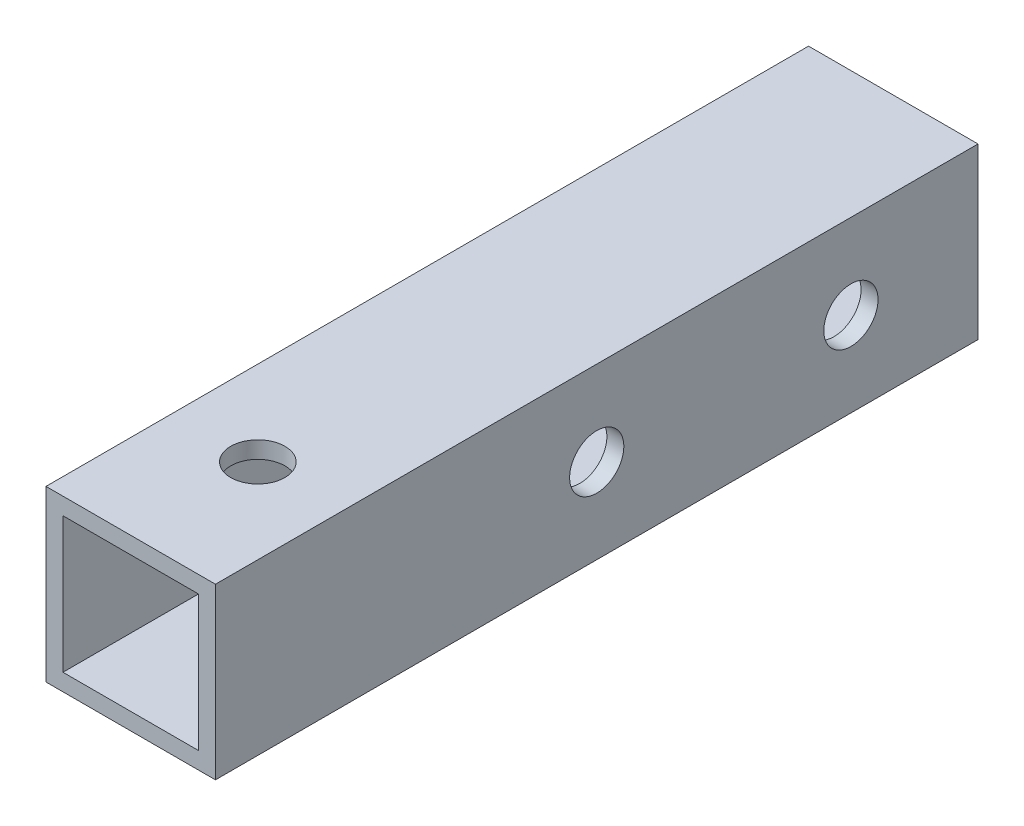
ISO-10303-21;
HEADER;
FILE_DESCRIPTION(('STEP AP214'),'2;1');
FILE_NAME('part.step','',(''),(''),'','','');
FILE_SCHEMA(('AUTOMOTIVE_DESIGN { 1 0 10303 214 1 1 1 1 }'));
ENDSEC;
DATA;
#1=APPLICATION_CONTEXT('core data for automotive mechanical design processes');
#2=APPLICATION_PROTOCOL_DEFINITION('international standard','automotive_design',2000,#1);
#3=PRODUCT_CONTEXT('',#1,'mechanical');
#4=PRODUCT('Part','Part','',(#3));
#5=PRODUCT_RELATED_PRODUCT_CATEGORY('part','',(#4));
#6=PRODUCT_DEFINITION_FORMATION('','',#4);
#7=PRODUCT_DEFINITION_CONTEXT('part definition',#1,'design');
#8=PRODUCT_DEFINITION('design','',#6,#7);
#9=PRODUCT_DEFINITION_SHAPE('','',#8);
#10=(LENGTH_UNIT() NAMED_UNIT(*) SI_UNIT(.MILLI.,.METRE.));
#11=(NAMED_UNIT(*) PLANE_ANGLE_UNIT() SI_UNIT($,.RADIAN.));
#12=(NAMED_UNIT(*) SI_UNIT($,.STERADIAN.) SOLID_ANGLE_UNIT());
#13=UNCERTAINTY_MEASURE_WITH_UNIT(LENGTH_MEASURE(1.E-05),#10,'distance_accuracy_value','');
#14=(GEOMETRIC_REPRESENTATION_CONTEXT(3) GLOBAL_UNCERTAINTY_ASSIGNED_CONTEXT((#13)) GLOBAL_UNIT_ASSIGNED_CONTEXT((#10,
#11,#12)) REPRESENTATION_CONTEXT('',''));
#15=CARTESIAN_POINT('',(0.,0.,0.));
#16=DIRECTION('',(0.,0.,1.));
#17=DIRECTION('',(1.,0.,0.));
#18=AXIS2_PLACEMENT_3D('',#15,#16,#17);
#19=CARTESIAN_POINT('',(0.,0.,45.));
#20=DIRECTION('',(0.,0.,1.));
#21=DIRECTION('',(1.,0.,0.));
#22=AXIS2_PLACEMENT_3D('',#19,#20,#21);
#23=PLANE('',#22);
#24=DIRECTION('',(0.,1.,0.));
#25=VECTOR('',#24,1.);
#26=CARTESIAN_POINT('',(5.00000000000002,-4.99999999999998,45.));
#27=LINE('',#26,#25);
#28=CARTESIAN_POINT('',(5.00000000000002,-4.99999999999998,45.));
#29=VERTEX_POINT('',#28);
#30=CARTESIAN_POINT('',(5.00000000000002,5.,45.));
#31=VERTEX_POINT('',#30);
#32=EDGE_CURVE('E162',#29,#31,#27,.T.);
#33=ORIENTED_EDGE('',*,*,#32,.T.);
#34=DIRECTION('',(-1.,0.,0.));
#35=VECTOR('',#34,1.);
#36=CARTESIAN_POINT('',(-4.99999999999998,5.,45.));
#37=LINE('',#36,#35);
#38=CARTESIAN_POINT('',(-4.99999999999998,5.,45.));
#39=VERTEX_POINT('',#38);
#40=EDGE_CURVE('E165',#31,#39,#37,.T.);
#41=ORIENTED_EDGE('',*,*,#40,.T.);
#42=DIRECTION('',(0.,-1.,0.));
#43=VECTOR('',#42,1.);
#44=CARTESIAN_POINT('',(-4.99999999999998,-4.99999999999998,45.));
#45=LINE('',#44,#43);
#46=CARTESIAN_POINT('',(-4.99999999999998,-4.99999999999998,45.));
#47=VERTEX_POINT('',#46);
#48=EDGE_CURVE('E168',#39,#47,#45,.T.);
#49=ORIENTED_EDGE('',*,*,#48,.T.);
#50=DIRECTION('',(1.,0.,0.));
#51=VECTOR('',#50,1.);
#52=CARTESIAN_POINT('',(-4.99999999999998,-4.99999999999998,45.));
#53=LINE('',#52,#51);
#54=EDGE_CURVE('E170',#47,#29,#53,.T.);
#55=ORIENTED_EDGE('',*,*,#54,.T.);
#56=EDGE_LOOP('',(#33,#41,#49,#55));
#57=FACE_BOUND('',#56,.T.);
#58=DIRECTION('',(-1.,0.,0.));
#59=VECTOR('',#58,1.);
#60=CARTESIAN_POINT('',(0.,4.,45.));
#61=LINE('',#60,#59);
#62=CARTESIAN_POINT('',(4.00000000000002,4.,45.));
#63=VERTEX_POINT('',#62);
#64=CARTESIAN_POINT('',(-3.99999999999998,4.,45.));
#65=VERTEX_POINT('',#64);
#66=EDGE_CURVE('E132',#63,#65,#61,.T.);
#67=ORIENTED_EDGE('',*,*,#66,.F.);
#68=DIRECTION('',(0.,1.,0.));
#69=VECTOR('',#68,1.);
#70=CARTESIAN_POINT('',(4.00000000000002,0.,45.));
#71=LINE('',#70,#69);
#72=CARTESIAN_POINT('',(4.00000000000002,-3.99999999999998,45.));
#73=VERTEX_POINT('',#72);
#74=EDGE_CURVE('E124',#73,#63,#71,.T.);
#75=ORIENTED_EDGE('',*,*,#74,.F.);
#76=DIRECTION('',(1.,0.,0.));
#77=VECTOR('',#76,1.);
#78=CARTESIAN_POINT('',(0.,-3.99999999999998,45.));
#79=LINE('',#78,#77);
#80=CARTESIAN_POINT('',(-3.99999999999998,-3.99999999999998,45.));
#81=VERTEX_POINT('',#80);
#82=EDGE_CURVE('E146',#81,#73,#79,.T.);
#83=ORIENTED_EDGE('',*,*,#82,.F.);
#84=DIRECTION('',(0.,-1.,0.));
#85=VECTOR('',#84,1.);
#86=CARTESIAN_POINT('',(-3.99999999999998,0.,45.));
#87=LINE('',#86,#85);
#88=EDGE_CURVE('E144',#65,#81,#87,.T.);
#89=ORIENTED_EDGE('',*,*,#88,.F.);
#90=EDGE_LOOP('',(#67,#75,#83,#89));
#91=FACE_BOUND('',#90,.T.);
#92=ADVANCED_FACE('F57',(#57,#91),#23,.T.);
#93=CARTESIAN_POINT('',(0.,0.,0.));
#94=DIRECTION('',(0.,0.,1.));
#95=DIRECTION('',(1.,0.,0.));
#96=AXIS2_PLACEMENT_3D('',#93,#94,#95);
#97=PLANE('',#96);
#98=DIRECTION('',(0.,1.,0.));
#99=VECTOR('',#98,1.);
#100=CARTESIAN_POINT('',(5.00000000000002,-4.99999999999998,0.));
#101=LINE('',#100,#99);
#102=CARTESIAN_POINT('',(5.00000000000002,-4.99999999999998,0.));
#103=VERTEX_POINT('',#102);
#104=CARTESIAN_POINT('',(5.00000000000002,5.,0.));
#105=VERTEX_POINT('',#104);
#106=EDGE_CURVE('E140',#103,#105,#101,.T.);
#107=ORIENTED_EDGE('',*,*,#106,.F.);
#108=DIRECTION('',(1.,0.,0.));
#109=VECTOR('',#108,1.);
#110=CARTESIAN_POINT('',(-4.99999999999998,-4.99999999999998,0.));
#111=LINE('',#110,#109);
#112=CARTESIAN_POINT('',(-4.99999999999998,-4.99999999999998,0.));
#113=VERTEX_POINT('',#112);
#114=EDGE_CURVE('E166',#113,#103,#111,.T.);
#115=ORIENTED_EDGE('',*,*,#114,.F.);
#116=DIRECTION('',(0.,-1.,0.));
#117=VECTOR('',#116,1.);
#118=CARTESIAN_POINT('',(-4.99999999999998,-4.99999999999998,0.));
#119=LINE('',#118,#117);
#120=CARTESIAN_POINT('',(-4.99999999999998,5.,0.));
#121=VERTEX_POINT('',#120);
#122=EDGE_CURVE('E177',#121,#113,#119,.T.);
#123=ORIENTED_EDGE('',*,*,#122,.F.);
#124=DIRECTION('',(-1.,0.,0.));
#125=VECTOR('',#124,1.);
#126=CARTESIAN_POINT('',(-4.99999999999998,5.,0.));
#127=LINE('',#126,#125);
#128=EDGE_CURVE('E175',#105,#121,#127,.T.);
#129=ORIENTED_EDGE('',*,*,#128,.F.);
#130=EDGE_LOOP('',(#107,#115,#123,#129));
#131=FACE_BOUND('',#130,.T.);
#132=DIRECTION('',(0.,1.,0.));
#133=VECTOR('',#132,1.);
#134=CARTESIAN_POINT('',(4.00000000000002,0.,0.));
#135=LINE('',#134,#133);
#136=CARTESIAN_POINT('',(4.00000000000002,-3.99999999999998,0.));
#137=VERTEX_POINT('',#136);
#138=CARTESIAN_POINT('',(4.00000000000002,4.,0.));
#139=VERTEX_POINT('',#138);
#140=EDGE_CURVE('E82',#137,#139,#135,.T.);
#141=ORIENTED_EDGE('',*,*,#140,.T.);
#142=DIRECTION('',(-1.,0.,0.));
#143=VECTOR('',#142,1.);
#144=CARTESIAN_POINT('',(0.,4.,0.));
#145=LINE('',#144,#143);
#146=CARTESIAN_POINT('',(-3.99999999999998,4.,0.));
#147=VERTEX_POINT('',#146);
#148=EDGE_CURVE('E139',#139,#147,#145,.T.);
#149=ORIENTED_EDGE('',*,*,#148,.T.);
#150=DIRECTION('',(0.,-1.,0.));
#151=VECTOR('',#150,1.);
#152=CARTESIAN_POINT('',(-3.99999999999998,0.,0.));
#153=LINE('',#152,#151);
#154=CARTESIAN_POINT('',(-3.99999999999998,-3.99999999999998,0.));
#155=VERTEX_POINT('',#154);
#156=EDGE_CURVE('E154',#147,#155,#153,.T.);
#157=ORIENTED_EDGE('',*,*,#156,.T.);
#158=DIRECTION('',(1.,0.,0.));
#159=VECTOR('',#158,1.);
#160=CARTESIAN_POINT('',(0.,-3.99999999999998,0.));
#161=LINE('',#160,#159);
#162=EDGE_CURVE('E133',#155,#137,#161,.T.);
#163=ORIENTED_EDGE('',*,*,#162,.T.);
#164=EDGE_LOOP('',(#141,#149,#157,#163));
#165=FACE_BOUND('',#164,.T.);
#166=ADVANCED_FACE('F239',(#131,#165),#97,.F.);
#167=CARTESIAN_POINT('',(5.00000000000002,-4.99999999999998,45.));
#168=DIRECTION('',(-1.,0.,0.));
#169=DIRECTION('',(0.,0.,1.));
#170=AXIS2_PLACEMENT_3D('',#167,#168,#169);
#171=PLANE('',#170);
#172=CARTESIAN_POINT('',(5.00000000000002,0.,22.5));
#173=DIRECTION('',(1.,0.,0.));
#174=DIRECTION('',(0.,0.,-1.));
#175=AXIS2_PLACEMENT_3D('',#172,#173,#174);
#176=CIRCLE('',#175,1.60000000000001);
#177=CARTESIAN_POINT('',(5.00000000000002,0.,20.9));
#178=VERTEX_POINT('',#177);
#179=EDGE_CURVE('E199',#178,#178,#176,.T.);
#180=ORIENTED_EDGE('',*,*,#179,.F.);
#181=EDGE_LOOP('',(#180));
#182=FACE_BOUND('',#181,.T.);
#183=CARTESIAN_POINT('',(5.00000000000002,0.,7.5));
#184=DIRECTION('',(1.,0.,0.));
#185=DIRECTION('',(0.,0.,-1.));
#186=AXIS2_PLACEMENT_3D('',#183,#184,#185);
#187=CIRCLE('',#186,1.6);
#188=CARTESIAN_POINT('',(5.00000000000002,0.,5.9));
#189=VERTEX_POINT('',#188);
#190=EDGE_CURVE('E209',#189,#189,#187,.T.);
#191=ORIENTED_EDGE('',*,*,#190,.F.);
#192=EDGE_LOOP('',(#191));
#193=FACE_BOUND('',#192,.T.);
#194=ORIENTED_EDGE('',*,*,#106,.T.);
#195=DIRECTION('',(0.,0.,-1.));
#196=VECTOR('',#195,1.);
#197=CARTESIAN_POINT('',(5.00000000000002,5.,45.));
#198=LINE('',#197,#196);
#199=EDGE_CURVE('E12',#31,#105,#198,.T.);
#200=ORIENTED_EDGE('',*,*,#199,.F.);
#201=ORIENTED_EDGE('',*,*,#32,.F.);
#202=DIRECTION('',(0.,0.,-1.));
#203=VECTOR('',#202,1.);
#204=CARTESIAN_POINT('',(5.00000000000002,-4.99999999999998,45.));
#205=LINE('',#204,#203);
#206=EDGE_CURVE('E172',#29,#103,#205,.T.);
#207=ORIENTED_EDGE('',*,*,#206,.T.);
#208=EDGE_LOOP('',(#194,#200,#201,#207));
#209=FACE_BOUND('',#208,.T.);
#210=ADVANCED_FACE('F59',(#182,#193,#209),#171,.F.);
#211=CARTESIAN_POINT('',(-4.99999999999998,5.,45.));
#212=DIRECTION('',(0.,-1.,0.));
#213=DIRECTION('',(0.,0.,-1.));
#214=AXIS2_PLACEMENT_3D('',#211,#212,#213);
#215=PLANE('',#214);
#216=CARTESIAN_POINT('',(0.,5.,37.5));
#217=DIRECTION('',(0.,1.,0.));
#218=DIRECTION('',(0.,0.,1.));
#219=AXIS2_PLACEMENT_3D('',#216,#217,#218);
#220=CIRCLE('',#219,1.6);
#221=CARTESIAN_POINT('',(0.,5.,39.1));
#222=VERTEX_POINT('',#221);
#223=EDGE_CURVE('E215',#222,#222,#220,.T.);
#224=ORIENTED_EDGE('',*,*,#223,.F.);
#225=EDGE_LOOP('',(#224));
#226=FACE_BOUND('',#225,.T.);
#227=ORIENTED_EDGE('',*,*,#128,.T.);
#228=DIRECTION('',(0.,0.,-1.));
#229=VECTOR('',#228,1.);
#230=CARTESIAN_POINT('',(-4.99999999999998,5.,45.));
#231=LINE('',#230,#229);
#232=EDGE_CURVE('E66',#39,#121,#231,.T.);
#233=ORIENTED_EDGE('',*,*,#232,.F.);
#234=ORIENTED_EDGE('',*,*,#40,.F.);
#235=ORIENTED_EDGE('',*,*,#199,.T.);
#236=EDGE_LOOP('',(#227,#233,#234,#235));
#237=FACE_BOUND('',#236,.T.);
#238=ADVANCED_FACE('F253',(#226,#237),#215,.F.);
#239=CARTESIAN_POINT('',(-4.99999999999998,-4.99999999999998,45.));
#240=DIRECTION('',(1.,0.,0.));
#241=DIRECTION('',(0.,0.,-1.));
#242=AXIS2_PLACEMENT_3D('',#239,#240,#241);
#243=PLANE('',#242);
#244=CARTESIAN_POINT('',(-4.99999999999998,0.,22.5));
#245=DIRECTION('',(1.,0.,0.));
#246=DIRECTION('',(0.,0.,-1.));
#247=AXIS2_PLACEMENT_3D('',#244,#245,#246);
#248=CIRCLE('',#247,1.60000000000001);
#249=CARTESIAN_POINT('',(-4.99999999999998,0.,20.9));
#250=VERTEX_POINT('',#249);
#251=EDGE_CURVE('E193',#250,#250,#248,.T.);
#252=ORIENTED_EDGE('',*,*,#251,.T.);
#253=EDGE_LOOP('',(#252));
#254=FACE_BOUND('',#253,.T.);
#255=CARTESIAN_POINT('',(-4.99999999999998,0.,7.5));
#256=DIRECTION('',(1.,0.,0.));
#257=DIRECTION('',(0.,0.,-1.));
#258=AXIS2_PLACEMENT_3D('',#255,#256,#257);
#259=CIRCLE('',#258,1.6);
#260=CARTESIAN_POINT('',(-4.99999999999998,0.,5.9));
#261=VERTEX_POINT('',#260);
#262=EDGE_CURVE('E204',#261,#261,#259,.T.);
#263=ORIENTED_EDGE('',*,*,#262,.T.);
#264=EDGE_LOOP('',(#263));
#265=FACE_BOUND('',#264,.T.);
#266=ORIENTED_EDGE('',*,*,#122,.T.);
#267=DIRECTION('',(0.,0.,-1.));
#268=VECTOR('',#267,1.);
#269=CARTESIAN_POINT('',(-4.99999999999998,-4.99999999999998,45.));
#270=LINE('',#269,#268);
#271=EDGE_CURVE('E182',#47,#113,#270,.T.);
#272=ORIENTED_EDGE('',*,*,#271,.F.);
#273=ORIENTED_EDGE('',*,*,#48,.F.);
#274=ORIENTED_EDGE('',*,*,#232,.T.);
#275=EDGE_LOOP('',(#266,#272,#273,#274));
#276=FACE_BOUND('',#275,.T.);
#277=ADVANCED_FACE('F250',(#254,#265,#276),#243,.F.);
#278=CARTESIAN_POINT('',(-4.99999999999998,-4.99999999999998,45.));
#279=DIRECTION('',(0.,1.,0.));
#280=DIRECTION('',(0.,0.,1.));
#281=AXIS2_PLACEMENT_3D('',#278,#279,#280);
#282=PLANE('',#281);
#283=CARTESIAN_POINT('',(0.,-4.99999999999998,37.5));
#284=DIRECTION('',(0.,1.,0.));
#285=DIRECTION('',(0.,0.,1.));
#286=AXIS2_PLACEMENT_3D('',#283,#284,#285);
#287=CIRCLE('',#286,1.6);
#288=CARTESIAN_POINT('',(0.,-4.99999999999998,39.1));
#289=VERTEX_POINT('',#288);
#290=EDGE_CURVE('E189',#289,#289,#287,.T.);
#291=ORIENTED_EDGE('',*,*,#290,.T.);
#292=EDGE_LOOP('',(#291));
#293=FACE_BOUND('',#292,.T.);
#294=ORIENTED_EDGE('',*,*,#114,.T.);
#295=ORIENTED_EDGE('',*,*,#206,.F.);
#296=ORIENTED_EDGE('',*,*,#54,.F.);
#297=ORIENTED_EDGE('',*,*,#271,.T.);
#298=EDGE_LOOP('',(#294,#295,#296,#297));
#299=FACE_BOUND('',#298,.T.);
#300=ADVANCED_FACE('F235',(#293,#299),#282,.F.);
#301=CARTESIAN_POINT('',(4.00000000000002,0.,45.));
#302=DIRECTION('',(-1.,0.,0.));
#303=DIRECTION('',(0.,0.,1.));
#304=AXIS2_PLACEMENT_3D('',#301,#302,#303);
#305=PLANE('',#304);
#306=CARTESIAN_POINT('',(4.00000000000002,0.,22.5));
#307=DIRECTION('',(-1.,0.,0.));
#308=DIRECTION('',(0.,0.,1.));
#309=AXIS2_PLACEMENT_3D('',#306,#307,#308);
#310=CIRCLE('',#309,1.60000000000001);
#311=CARTESIAN_POINT('',(4.00000000000002,0.,24.1));
#312=VERTEX_POINT('',#311);
#313=EDGE_CURVE('E212',#312,#312,#310,.T.);
#314=ORIENTED_EDGE('',*,*,#313,.F.);
#315=EDGE_LOOP('',(#314));
#316=FACE_BOUND('',#315,.T.);
#317=CARTESIAN_POINT('',(4.00000000000002,0.,7.5));
#318=DIRECTION('',(-1.,0.,0.));
#319=DIRECTION('',(0.,0.,1.));
#320=AXIS2_PLACEMENT_3D('',#317,#318,#319);
#321=CIRCLE('',#320,1.6);
#322=CARTESIAN_POINT('',(4.00000000000002,0.,9.1));
#323=VERTEX_POINT('',#322);
#324=EDGE_CURVE('E192',#323,#323,#321,.T.);
#325=ORIENTED_EDGE('',*,*,#324,.F.);
#326=EDGE_LOOP('',(#325));
#327=FACE_BOUND('',#326,.T.);
#328=ORIENTED_EDGE('',*,*,#140,.F.);
#329=DIRECTION('',(0.,0.,-1.));
#330=VECTOR('',#329,1.);
#331=CARTESIAN_POINT('',(4.00000000000002,-3.99999999999998,45.));
#332=LINE('',#331,#330);
#333=EDGE_CURVE('E128',#73,#137,#332,.T.);
#334=ORIENTED_EDGE('',*,*,#333,.F.);
#335=ORIENTED_EDGE('',*,*,#74,.T.);
#336=DIRECTION('',(0.,0.,-1.));
#337=VECTOR('',#336,1.);
#338=CARTESIAN_POINT('',(4.00000000000002,4.,45.));
#339=LINE('',#338,#337);
#340=EDGE_CURVE('E127',#63,#139,#339,.T.);
#341=ORIENTED_EDGE('',*,*,#340,.T.);
#342=EDGE_LOOP('',(#328,#334,#335,#341));
#343=FACE_BOUND('',#342,.T.);
#344=ADVANCED_FACE('F126',(#316,#327,#343),#305,.T.);
#345=CARTESIAN_POINT('',(0.,4.,45.));
#346=DIRECTION('',(0.,-1.,0.));
#347=DIRECTION('',(0.,0.,-1.));
#348=AXIS2_PLACEMENT_3D('',#345,#346,#347);
#349=PLANE('',#348);
#350=CARTESIAN_POINT('',(0.,4.,37.5));
#351=DIRECTION('',(0.,-1.,0.));
#352=DIRECTION('',(0.,0.,-1.));
#353=AXIS2_PLACEMENT_3D('',#350,#351,#352);
#354=CIRCLE('',#353,1.6);
#355=CARTESIAN_POINT('',(0.,4.,35.9));
#356=VERTEX_POINT('',#355);
#357=EDGE_CURVE('E152',#356,#356,#354,.T.);
#358=ORIENTED_EDGE('',*,*,#357,.F.);
#359=EDGE_LOOP('',(#358));
#360=FACE_BOUND('',#359,.T.);
#361=ORIENTED_EDGE('',*,*,#148,.F.);
#362=ORIENTED_EDGE('',*,*,#340,.F.);
#363=ORIENTED_EDGE('',*,*,#66,.T.);
#364=DIRECTION('',(0.,0.,-1.));
#365=VECTOR('',#364,1.);
#366=CARTESIAN_POINT('',(-3.99999999999998,4.,45.));
#367=LINE('',#366,#365);
#368=EDGE_CURVE('E141',#65,#147,#367,.T.);
#369=ORIENTED_EDGE('',*,*,#368,.T.);
#370=EDGE_LOOP('',(#361,#362,#363,#369));
#371=FACE_BOUND('',#370,.T.);
#372=ADVANCED_FACE('F136',(#360,#371),#349,.T.);
#373=CARTESIAN_POINT('',(-3.99999999999998,0.,45.));
#374=DIRECTION('',(1.,0.,0.));
#375=DIRECTION('',(0.,0.,-1.));
#376=AXIS2_PLACEMENT_3D('',#373,#374,#375);
#377=PLANE('',#376);
#378=CARTESIAN_POINT('',(-3.99999999999998,0.,22.5));
#379=DIRECTION('',(1.,0.,0.));
#380=DIRECTION('',(0.,0.,-1.));
#381=AXIS2_PLACEMENT_3D('',#378,#379,#380);
#382=CIRCLE('',#381,1.60000000000001);
#383=CARTESIAN_POINT('',(-3.99999999999998,0.,20.9));
#384=VERTEX_POINT('',#383);
#385=EDGE_CURVE('E61',#384,#384,#382,.T.);
#386=ORIENTED_EDGE('',*,*,#385,.F.);
#387=EDGE_LOOP('',(#386));
#388=FACE_BOUND('',#387,.T.);
#389=CARTESIAN_POINT('',(-3.99999999999998,0.,7.5));
#390=DIRECTION('',(1.,0.,0.));
#391=DIRECTION('',(0.,0.,-1.));
#392=AXIS2_PLACEMENT_3D('',#389,#390,#391);
#393=CIRCLE('',#392,1.6);
#394=CARTESIAN_POINT('',(-3.99999999999998,0.,5.9));
#395=VERTEX_POINT('',#394);
#396=EDGE_CURVE('E190',#395,#395,#393,.T.);
#397=ORIENTED_EDGE('',*,*,#396,.F.);
#398=EDGE_LOOP('',(#397));
#399=FACE_BOUND('',#398,.T.);
#400=ORIENTED_EDGE('',*,*,#156,.F.);
#401=ORIENTED_EDGE('',*,*,#368,.F.);
#402=ORIENTED_EDGE('',*,*,#88,.T.);
#403=DIRECTION('',(0.,0.,-1.));
#404=VECTOR('',#403,1.);
#405=CARTESIAN_POINT('',(-3.99999999999998,-3.99999999999998,45.));
#406=LINE('',#405,#404);
#407=EDGE_CURVE('E74',#81,#155,#406,.T.);
#408=ORIENTED_EDGE('',*,*,#407,.T.);
#409=EDGE_LOOP('',(#400,#401,#402,#408));
#410=FACE_BOUND('',#409,.T.);
#411=ADVANCED_FACE('F226',(#388,#399,#410),#377,.T.);
#412=CARTESIAN_POINT('',(0.,-3.99999999999998,45.));
#413=DIRECTION('',(0.,1.,0.));
#414=DIRECTION('',(0.,0.,1.));
#415=AXIS2_PLACEMENT_3D('',#412,#413,#414);
#416=PLANE('',#415);
#417=CARTESIAN_POINT('',(0.,-3.99999999999998,37.5));
#418=DIRECTION('',(0.,1.,0.));
#419=DIRECTION('',(0.,0.,1.));
#420=AXIS2_PLACEMENT_3D('',#417,#418,#419);
#421=CIRCLE('',#420,1.6);
#422=CARTESIAN_POINT('',(0.,-3.99999999999998,39.1));
#423=VERTEX_POINT('',#422);
#424=EDGE_CURVE('E187',#423,#423,#421,.T.);
#425=ORIENTED_EDGE('',*,*,#424,.F.);
#426=EDGE_LOOP('',(#425));
#427=FACE_BOUND('',#426,.T.);
#428=ORIENTED_EDGE('',*,*,#162,.F.);
#429=ORIENTED_EDGE('',*,*,#407,.F.);
#430=ORIENTED_EDGE('',*,*,#82,.T.);
#431=ORIENTED_EDGE('',*,*,#333,.T.);
#432=EDGE_LOOP('',(#428,#429,#430,#431));
#433=FACE_BOUND('',#432,.T.);
#434=ADVANCED_FACE('F232',(#427,#433),#416,.T.);
#435=CARTESIAN_POINT('',(0.,-4.99999999999998,37.5));
#436=DIRECTION('',(0.,1.,0.));
#437=DIRECTION('',(0.,0.,1.));
#438=AXIS2_PLACEMENT_3D('',#435,#436,#437);
#439=CYLINDRICAL_SURFACE('',#438,1.6);
#440=ORIENTED_EDGE('',*,*,#424,.T.);
#441=EDGE_LOOP('',(#440));
#442=FACE_BOUND('',#441,.T.);
#443=ORIENTED_EDGE('',*,*,#290,.F.);
#444=EDGE_LOOP('',(#443));
#445=FACE_BOUND('',#444,.T.);
#446=ADVANCED_FACE('F278',(#442,#445),#439,.F.);
#447=ORIENTED_EDGE('',*,*,#357,.T.);
#448=EDGE_LOOP('',(#447));
#449=FACE_BOUND('',#448,.T.);
#450=ORIENTED_EDGE('',*,*,#223,.T.);
#451=EDGE_LOOP('',(#450));
#452=FACE_BOUND('',#451,.T.);
#453=ADVANCED_FACE('F222',(#449,#452),#439,.F.);
#454=CARTESIAN_POINT('',(-4.99999999999998,0.,7.5));
#455=DIRECTION('',(1.,0.,0.));
#456=DIRECTION('',(0.,0.,-1.));
#457=AXIS2_PLACEMENT_3D('',#454,#455,#456);
#458=CYLINDRICAL_SURFACE('',#457,1.6);
#459=ORIENTED_EDGE('',*,*,#396,.T.);
#460=EDGE_LOOP('',(#459));
#461=FACE_BOUND('',#460,.T.);
#462=ORIENTED_EDGE('',*,*,#262,.F.);
#463=EDGE_LOOP('',(#462));
#464=FACE_BOUND('',#463,.T.);
#465=ADVANCED_FACE('F288',(#461,#464),#458,.F.);
#466=CARTESIAN_POINT('',(-4.99999999999998,0.,22.5));
#467=DIRECTION('',(1.,0.,0.));
#468=DIRECTION('',(0.,0.,-1.));
#469=AXIS2_PLACEMENT_3D('',#466,#467,#468);
#470=CYLINDRICAL_SURFACE('',#469,1.60000000000001);
#471=ORIENTED_EDGE('',*,*,#385,.T.);
#472=EDGE_LOOP('',(#471));
#473=FACE_BOUND('',#472,.T.);
#474=ORIENTED_EDGE('',*,*,#251,.F.);
#475=EDGE_LOOP('',(#474));
#476=FACE_BOUND('',#475,.T.);
#477=ADVANCED_FACE('F291',(#473,#476),#470,.F.);
#478=ORIENTED_EDGE('',*,*,#324,.T.);
#479=EDGE_LOOP('',(#478));
#480=FACE_BOUND('',#479,.T.);
#481=ORIENTED_EDGE('',*,*,#190,.T.);
#482=EDGE_LOOP('',(#481));
#483=FACE_BOUND('',#482,.T.);
#484=ADVANCED_FACE('F292',(#480,#483),#458,.F.);
#485=ORIENTED_EDGE('',*,*,#313,.T.);
#486=EDGE_LOOP('',(#485));
#487=FACE_BOUND('',#486,.T.);
#488=ORIENTED_EDGE('',*,*,#179,.T.);
#489=EDGE_LOOP('',(#488));
#490=FACE_BOUND('',#489,.T.);
#491=ADVANCED_FACE('F295',(#487,#490),#470,.F.);
#492=CLOSED_SHELL('',(#92,#166,#210,#238,#277,#300,#344,#372,#411,#434,#446,#453,#465,#477,#484,#491));
#493=MANIFOLD_SOLID_BREP('B2',#492);
#494=ADVANCED_BREP_SHAPE_REPRESENTATION('',(#18,#493),#14);
#495=SHAPE_DEFINITION_REPRESENTATION(#9,#494);
ENDSEC;
END-ISO-10303-21;
